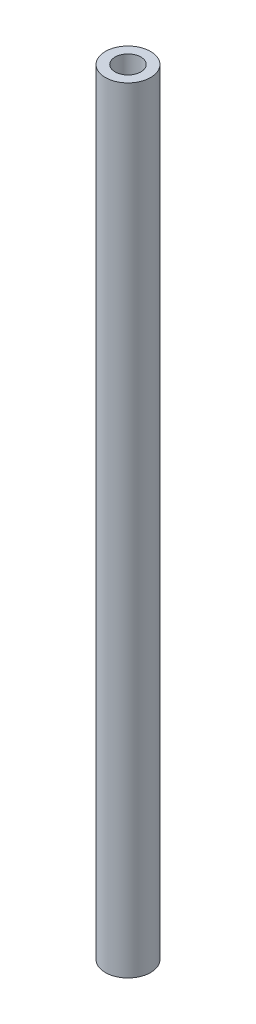
ISO-10303-21;
HEADER;
FILE_DESCRIPTION(('STEP AP214'),'2;1');
FILE_NAME('part.step','',(''),(''),'','','');
FILE_SCHEMA(('AUTOMOTIVE_DESIGN { 1 0 10303 214 1 1 1 1 }'));
ENDSEC;
DATA;
#1=APPLICATION_CONTEXT('core data for automotive mechanical design processes');
#2=APPLICATION_PROTOCOL_DEFINITION('international standard','automotive_design',2000,#1);
#3=PRODUCT_CONTEXT('',#1,'mechanical');
#4=PRODUCT('Part','Part','',(#3));
#5=PRODUCT_RELATED_PRODUCT_CATEGORY('part','',(#4));
#6=PRODUCT_DEFINITION_FORMATION('','',#4);
#7=PRODUCT_DEFINITION_CONTEXT('part definition',#1,'design');
#8=PRODUCT_DEFINITION('design','',#6,#7);
#9=PRODUCT_DEFINITION_SHAPE('','',#8);
#10=(LENGTH_UNIT() NAMED_UNIT(*) SI_UNIT(.MILLI.,.METRE.));
#11=(NAMED_UNIT(*) PLANE_ANGLE_UNIT() SI_UNIT($,.RADIAN.));
#12=(NAMED_UNIT(*) SI_UNIT($,.STERADIAN.) SOLID_ANGLE_UNIT());
#13=UNCERTAINTY_MEASURE_WITH_UNIT(LENGTH_MEASURE(1.E-05),#10,'distance_accuracy_value','');
#14=(GEOMETRIC_REPRESENTATION_CONTEXT(3) GLOBAL_UNCERTAINTY_ASSIGNED_CONTEXT((#13)) GLOBAL_UNIT_ASSIGNED_CONTEXT((#10,
#11,#12)) REPRESENTATION_CONTEXT('',''));
#15=CARTESIAN_POINT('',(0.,0.,0.));
#16=DIRECTION('',(0.,0.,1.));
#17=DIRECTION('',(1.,0.,0.));
#18=AXIS2_PLACEMENT_3D('',#15,#16,#17);
#19=CARTESIAN_POINT('',(0.,60.,0.));
#20=DIRECTION('',(0.,1.,0.));
#21=DIRECTION('',(0.,0.,1.));
#22=AXIS2_PLACEMENT_3D('',#19,#20,#21);
#23=PLANE('',#22);
#24=CARTESIAN_POINT('',(0.,60.,0.));
#25=DIRECTION('',(0.,1.,0.));
#26=DIRECTION('',(0.,0.,1.));
#27=AXIS2_PLACEMENT_3D('',#24,#25,#26);
#28=CIRCLE('',#27,1.75);
#29=CARTESIAN_POINT('',(0.,60.,1.75));
#30=VERTEX_POINT('',#29);
#31=EDGE_CURVE('E10',#30,#30,#28,.T.);
#32=ORIENTED_EDGE('',*,*,#31,.T.);
#33=EDGE_LOOP('',(#32));
#34=FACE_BOUND('',#33,.T.);
#35=CARTESIAN_POINT('',(0.,60.,0.));
#36=DIRECTION('',(0.,1.,0.));
#37=DIRECTION('',(0.,0.,1.));
#38=AXIS2_PLACEMENT_3D('',#35,#36,#37);
#39=CIRCLE('',#38,1.);
#40=CARTESIAN_POINT('',(0.,60.,1.));
#41=VERTEX_POINT('',#40);
#42=EDGE_CURVE('E54',#41,#41,#39,.T.);
#43=ORIENTED_EDGE('',*,*,#42,.F.);
#44=EDGE_LOOP('',(#43));
#45=FACE_BOUND('',#44,.T.);
#46=ADVANCED_FACE('F41',(#34,#45),#23,.T.);
#47=CARTESIAN_POINT('',(0.,0.,0.));
#48=DIRECTION('',(0.,1.,0.));
#49=DIRECTION('',(0.,0.,1.));
#50=AXIS2_PLACEMENT_3D('',#47,#48,#49);
#51=PLANE('',#50);
#52=CARTESIAN_POINT('',(0.,0.,0.));
#53=DIRECTION('',(0.,1.,0.));
#54=DIRECTION('',(0.,0.,1.));
#55=AXIS2_PLACEMENT_3D('',#52,#53,#54);
#56=CIRCLE('',#55,1.75);
#57=CARTESIAN_POINT('',(0.,0.,1.75));
#58=VERTEX_POINT('',#57);
#59=EDGE_CURVE('E45',#58,#58,#56,.T.);
#60=ORIENTED_EDGE('',*,*,#59,.F.);
#61=EDGE_LOOP('',(#60));
#62=FACE_BOUND('',#61,.T.);
#63=CARTESIAN_POINT('',(0.,0.,0.));
#64=DIRECTION('',(0.,1.,0.));
#65=DIRECTION('',(0.,0.,1.));
#66=AXIS2_PLACEMENT_3D('',#63,#64,#65);
#67=CIRCLE('',#66,1.);
#68=CARTESIAN_POINT('',(0.,0.,1.));
#69=VERTEX_POINT('',#68);
#70=EDGE_CURVE('E56',#69,#69,#67,.T.);
#71=ORIENTED_EDGE('',*,*,#70,.T.);
#72=EDGE_LOOP('',(#71));
#73=FACE_BOUND('',#72,.T.);
#74=ADVANCED_FACE('F68',(#62,#73),#51,.F.);
#75=CARTESIAN_POINT('',(0.,60.,0.));
#76=DIRECTION('',(0.,-1.,0.));
#77=DIRECTION('',(0.,0.,-1.));
#78=AXIS2_PLACEMENT_3D('',#75,#76,#77);
#79=CYLINDRICAL_SURFACE('',#78,1.75);
#80=ORIENTED_EDGE('',*,*,#31,.F.);
#81=EDGE_LOOP('',(#80));
#82=FACE_BOUND('',#81,.T.);
#83=ORIENTED_EDGE('',*,*,#59,.T.);
#84=EDGE_LOOP('',(#83));
#85=FACE_BOUND('',#84,.T.);
#86=ADVANCED_FACE('F43',(#82,#85),#79,.T.);
#87=CARTESIAN_POINT('',(0.,60.,0.));
#88=DIRECTION('',(0.,-1.,0.));
#89=DIRECTION('',(0.,0.,-1.));
#90=AXIS2_PLACEMENT_3D('',#87,#88,#89);
#91=CYLINDRICAL_SURFACE('',#90,1.);
#92=ORIENTED_EDGE('',*,*,#42,.T.);
#93=EDGE_LOOP('',(#92));
#94=FACE_BOUND('',#93,.T.);
#95=ORIENTED_EDGE('',*,*,#70,.F.);
#96=EDGE_LOOP('',(#95));
#97=FACE_BOUND('',#96,.T.);
#98=ADVANCED_FACE('F64',(#94,#97),#91,.F.);
#99=CLOSED_SHELL('',(#46,#74,#86,#98));
#100=MANIFOLD_SOLID_BREP('B2',#99);
#101=ADVANCED_BREP_SHAPE_REPRESENTATION('',(#18,#100),#14);
#102=SHAPE_DEFINITION_REPRESENTATION(#9,#101);
ENDSEC;
END-ISO-10303-21;
